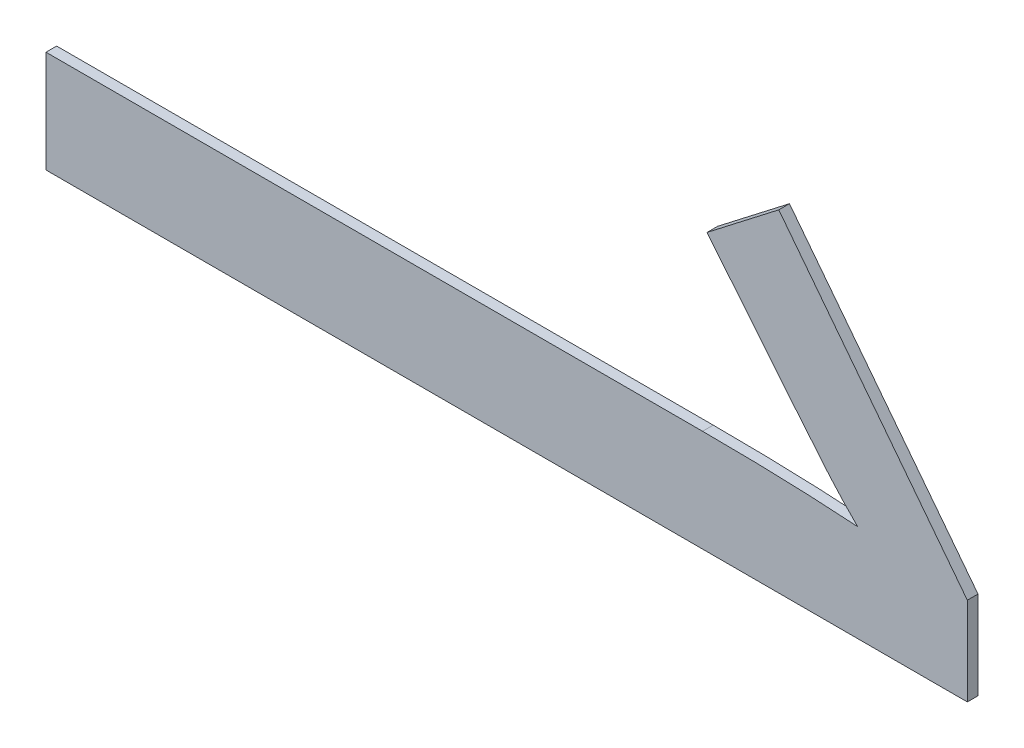
ISO-10303-21;
HEADER;
FILE_DESCRIPTION(('STEP AP214'),'2;1');
FILE_NAME('part.step','',(''),(''),'','','');
FILE_SCHEMA(('AUTOMOTIVE_DESIGN { 1 0 10303 214 1 1 1 1 }'));
ENDSEC;
DATA;
#1=APPLICATION_CONTEXT('core data for automotive mechanical design processes');
#2=APPLICATION_PROTOCOL_DEFINITION('international standard','automotive_design',2000,#1);
#3=PRODUCT_CONTEXT('',#1,'mechanical');
#4=PRODUCT('Part','Part','',(#3));
#5=PRODUCT_RELATED_PRODUCT_CATEGORY('part','',(#4));
#6=PRODUCT_DEFINITION_FORMATION('','',#4);
#7=PRODUCT_DEFINITION_CONTEXT('part definition',#1,'design');
#8=PRODUCT_DEFINITION('design','',#6,#7);
#9=PRODUCT_DEFINITION_SHAPE('','',#8);
#10=(LENGTH_UNIT() NAMED_UNIT(*) SI_UNIT(.MILLI.,.METRE.));
#11=(NAMED_UNIT(*) PLANE_ANGLE_UNIT() SI_UNIT($,.RADIAN.));
#12=(NAMED_UNIT(*) SI_UNIT($,.STERADIAN.) SOLID_ANGLE_UNIT());
#13=UNCERTAINTY_MEASURE_WITH_UNIT(LENGTH_MEASURE(1.E-05),#10,'distance_accuracy_value','');
#14=(GEOMETRIC_REPRESENTATION_CONTEXT(3) GLOBAL_UNCERTAINTY_ASSIGNED_CONTEXT((#13)) GLOBAL_UNIT_ASSIGNED_CONTEXT((#10,
#11,#12)) REPRESENTATION_CONTEXT('',''));
#15=CARTESIAN_POINT('',(0.,0.,0.));
#16=DIRECTION('',(0.,0.,1.));
#17=DIRECTION('',(1.,0.,0.));
#18=AXIS2_PLACEMENT_3D('',#15,#16,#17);
#19=CARTESIAN_POINT('',(32.574920494297,13.734089114766,2.64));
#20=DIRECTION('',(0.,0.,1.));
#21=DIRECTION('',(1.,0.,0.));
#22=AXIS2_PLACEMENT_3D('',#19,#20,#21);
#23=PLANE('',#22);
#24=DIRECTION('',(1.,0.,0.));
#25=VECTOR('',#24,1.);
#26=CARTESIAN_POINT('',(33.916548688995,13.474681045093,2.64));
#27=LINE('',#26,#25);
#28=CARTESIAN_POINT('',(33.608555256577,13.474681045093,2.64));
#29=VERTEX_POINT('',#28);
#30=CARTESIAN_POINT('',(34.224542121413,13.474681045093,2.64));
#31=VERTEX_POINT('',#30);
#32=EDGE_CURVE('E94',#29,#31,#27,.T.);
#33=ORIENTED_EDGE('',*,*,#32,.T.);
#34=CARTESIAN_POINT('',(34.370025505644,13.469951416216,2.64));
#35=CARTESIAN_POINT('',(34.301540479517,13.474681045093,2.64));
#36=CARTESIAN_POINT('',(34.224542121413,13.474681045093,2.64));
#37=B_SPLINE_CURVE_WITH_KNOTS('',2,(#34,#35,#36),.UNSPECIFIED.,.F.,.F.,(3,3),(0.,1.),.UNSPECIFIED.);
#38=CARTESIAN_POINT('',(34.370025505644,13.469951416216,2.64));
#39=VERTEX_POINT('',#38);
#40=EDGE_CURVE('E118',#31,#39,#37,.F.);
#41=ORIENTED_EDGE('',*,*,#40,.T.);
#42=CARTESIAN_POINT('',(34.370025505644,13.469951416216,2.64));
#43=CARTESIAN_POINT('',(34.357539285411,13.482248451294,2.64));
#44=CARTESIAN_POINT('',(34.344012546825,13.497667041431,2.64));
#45=(BOUNDED_CURVE() B_SPLINE_CURVE(2,(#42,#43,#44),.UNSPECIFIED.,.F.,
.F.) B_SPLINE_CURVE_WITH_KNOTS((3,3),(0.,1.),
.UNSPECIFIED.) CURVE() GEOMETRIC_REPRESENTATION_ITEM() RATIONAL_B_SPLINE_CURVE((1.,1.,1.)) REPRESENTATION_ITEM(''));
#46=CARTESIAN_POINT('',(34.344012546825,13.497667041431,2.64));
#47=VERTEX_POINT('',#46);
#48=EDGE_CURVE('E65',#39,#47,#45,.T.);
#49=ORIENTED_EDGE('',*,*,#48,.T.);
#50=CARTESIAN_POINT('',(34.344012546825,13.497667041431,2.64));
#51=CARTESIAN_POINT('',(34.330485808239,13.513085631567,2.64));
#52=CARTESIAN_POINT('',(34.228704194824,13.638326204209,2.64));
#53=(BOUNDED_CURVE() B_SPLINE_CURVE(2,(#50,#51,#52),.UNSPECIFIED.,.F.,
.F.) B_SPLINE_CURVE_WITH_KNOTS((3,3),(0.,1.),
.UNSPECIFIED.) CURVE() GEOMETRIC_REPRESENTATION_ITEM() RATIONAL_B_SPLINE_CURVE((1.,1.,1.)) REPRESENTATION_ITEM(''));
#54=CARTESIAN_POINT('',(34.228704194824,13.638326204209,2.64));
#55=VERTEX_POINT('',#54);
#56=EDGE_CURVE('E21',#47,#55,#53,.T.);
#57=ORIENTED_EDGE('',*,*,#56,.T.);
#58=DIRECTION('',(0.791382768118889,0.611320958518915,0.));
#59=VECTOR('',#58,1.);
#60=CARTESIAN_POINT('',(34.262379152422,13.664339163028,2.64));
#61=LINE('',#60,#59);
#62=CARTESIAN_POINT('',(34.2960541100209,13.6903521218474,2.64));
#63=VERTEX_POINT('',#62);
#64=EDGE_CURVE('E73',#55,#63,#61,.T.);
#65=ORIENTED_EDGE('',*,*,#64,.T.);
#66=DIRECTION('',(0.611764018259349,-0.791040318797452,0.));
#67=VECTOR('',#66,1.);
#68=CARTESIAN_POINT('',(34.384498170006,13.575989695621,2.64));
#69=LINE('',#68,#67);
#70=CARTESIAN_POINT('',(34.4729422299905,13.4616272693946,2.64));
#71=VERTEX_POINT('',#70);
#72=EDGE_CURVE('E134',#63,#71,#69,.T.);
#73=ORIENTED_EDGE('',*,*,#72,.T.);
#74=DIRECTION('',(0.,1.,0.));
#75=VECTOR('',#74,1.);
#76=CARTESIAN_POINT('',(34.47294222999,13.420290313016,2.64));
#77=LINE('',#76,#75);
#78=CARTESIAN_POINT('',(34.47294222999,13.378953356638,2.64));
#79=VERTEX_POINT('',#78);
#80=EDGE_CURVE('E139',#71,#79,#77,.F.);
#81=ORIENTED_EDGE('',*,*,#80,.T.);
#82=DIRECTION('',(-1.,0.,0.));
#83=VECTOR('',#82,1.);
#84=CARTESIAN_POINT('',(34.040748743283,13.378953356638,2.64));
#85=LINE('',#84,#83);
#86=CARTESIAN_POINT('',(33.608555256577,13.378953356638,2.64));
#87=VERTEX_POINT('',#86);
#88=EDGE_CURVE('E96',#79,#87,#85,.T.);
#89=ORIENTED_EDGE('',*,*,#88,.T.);
#90=DIRECTION('',(0.,1.,0.));
#91=VECTOR('',#90,1.);
#92=CARTESIAN_POINT('',(33.608555256577,13.426817200865,2.64));
#93=LINE('',#92,#91);
#94=EDGE_CURVE('E91',#87,#29,#93,.T.);
#95=ORIENTED_EDGE('',*,*,#94,.T.);
#96=EDGE_LOOP('',(#33,#41,#49,#57,#65,#73,#81,#89,#95));
#97=FACE_BOUND('',#96,.T.);
#98=ADVANCED_FACE('F17',(#97),#23,.F.);
#99=CARTESIAN_POINT('',(33.608555256577,13.426817200865,2.64));
#100=DIRECTION('',(1.,0.,0.));
#101=DIRECTION('',(0.,0.,-1.));
#102=AXIS2_PLACEMENT_3D('',#99,#100,#101);
#103=PLANE('',#102);
#104=DIRECTION('',(0.,0.,-1.));
#105=VECTOR('',#104,1.);
#106=CARTESIAN_POINT('',(33.608555256577,13.474681045093,2.64));
#107=LINE('',#106,#105);
#108=CARTESIAN_POINT('',(33.608555256577,13.474681045093,2.65));
#109=VERTEX_POINT('',#108);
#110=EDGE_CURVE('E102',#109,#29,#107,.T.);
#111=ORIENTED_EDGE('',*,*,#110,.T.);
#112=ORIENTED_EDGE('',*,*,#94,.F.);
#113=DIRECTION('',(0.,0.,1.));
#114=VECTOR('',#113,1.);
#115=CARTESIAN_POINT('',(33.608555256577,13.378953356638,2.64));
#116=LINE('',#115,#114);
#117=CARTESIAN_POINT('',(33.608555256577,13.378953356638,2.65));
#118=VERTEX_POINT('',#117);
#119=EDGE_CURVE('E141',#87,#118,#116,.T.);
#120=ORIENTED_EDGE('',*,*,#119,.T.);
#121=DIRECTION('',(0.,1.,0.));
#122=VECTOR('',#121,1.);
#123=CARTESIAN_POINT('',(33.608555256577,13.734089114766,2.65));
#124=LINE('',#123,#122);
#125=EDGE_CURVE('E105',#109,#118,#124,.F.);
#126=ORIENTED_EDGE('',*,*,#125,.F.);
#127=EDGE_LOOP('',(#111,#112,#120,#126));
#128=FACE_BOUND('',#127,.T.);
#129=ADVANCED_FACE('F103',(#128),#103,.F.);
#130=CARTESIAN_POINT('',(34.040748743283,13.378953356638,2.64));
#131=DIRECTION('',(0.,1.,0.));
#132=DIRECTION('',(-1.,0.,0.));
#133=AXIS2_PLACEMENT_3D('',#130,#131,#132);
#134=PLANE('',#133);
#135=ORIENTED_EDGE('',*,*,#119,.F.);
#136=ORIENTED_EDGE('',*,*,#88,.F.);
#137=DIRECTION('',(0.,0.,1.));
#138=VECTOR('',#137,1.);
#139=CARTESIAN_POINT('',(34.47294222999,13.378953356638,2.64));
#140=LINE('',#139,#138);
#141=CARTESIAN_POINT('',(34.47294222999,13.378953356638,2.65));
#142=VERTEX_POINT('',#141);
#143=EDGE_CURVE('E136',#79,#142,#140,.T.);
#144=ORIENTED_EDGE('',*,*,#143,.T.);
#145=DIRECTION('',(1.,0.,0.));
#146=VECTOR('',#145,1.);
#147=CARTESIAN_POINT('',(32.574920494297,13.378953356638,2.65));
#148=LINE('',#147,#146);
#149=EDGE_CURVE('E200',#118,#142,#148,.T.);
#150=ORIENTED_EDGE('',*,*,#149,.F.);
#151=EDGE_LOOP('',(#135,#136,#144,#150));
#152=FACE_BOUND('',#151,.T.);
#153=ADVANCED_FACE('F211',(#152),#134,.F.);
#154=CARTESIAN_POINT('',(34.47294222999,13.420290313016,2.64));
#155=DIRECTION('',(-1.,0.,0.));
#156=DIRECTION('',(0.,0.,1.));
#157=AXIS2_PLACEMENT_3D('',#154,#155,#156);
#158=PLANE('',#157);
#159=ORIENTED_EDGE('',*,*,#143,.F.);
#160=ORIENTED_EDGE('',*,*,#80,.F.);
#161=DIRECTION('',(0.,0.,1.));
#162=VECTOR('',#161,1.);
#163=CARTESIAN_POINT('',(34.4729422299908,13.4616272693946,2.64));
#164=LINE('',#163,#162);
#165=CARTESIAN_POINT('',(34.4729422299903,13.4616272693942,2.65));
#166=VERTEX_POINT('',#165);
#167=EDGE_CURVE('E131',#71,#166,#164,.T.);
#168=ORIENTED_EDGE('',*,*,#167,.T.);
#169=DIRECTION('',(0.,1.,0.));
#170=VECTOR('',#169,1.);
#171=CARTESIAN_POINT('',(34.47294222999,13.734089114766,2.65));
#172=LINE('',#171,#170);
#173=EDGE_CURVE('E191',#142,#166,#172,.T.);
#174=ORIENTED_EDGE('',*,*,#173,.F.);
#175=EDGE_LOOP('',(#159,#160,#168,#174));
#176=FACE_BOUND('',#175,.T.);
#177=ADVANCED_FACE('F257',(#176),#158,.F.);
#178=CARTESIAN_POINT('',(34.384498170006,13.575989695621,2.64));
#179=DIRECTION('',(-0.791040318797452,-0.611764018259349,0.));
#180=DIRECTION('',(0.611764018259349,-0.791040318797452,0.));
#181=AXIS2_PLACEMENT_3D('',#178,#179,#180);
#182=PLANE('',#181);
#183=ORIENTED_EDGE('',*,*,#167,.F.);
#184=ORIENTED_EDGE('',*,*,#72,.F.);
#185=DIRECTION('',(0.,0.,1.));
#186=VECTOR('',#185,1.);
#187=CARTESIAN_POINT('',(34.2960541100208,13.6903521218473,2.64));
#188=LINE('',#187,#186);
#189=CARTESIAN_POINT('',(34.2960541100209,13.6903521218471,2.65));
#190=VERTEX_POINT('',#189);
#191=EDGE_CURVE('E130',#63,#190,#188,.T.);
#192=ORIENTED_EDGE('',*,*,#191,.T.);
#193=DIRECTION('',(-0.611764018257532,0.791040318798858,0.));
#194=VECTOR('',#193,1.);
#195=CARTESIAN_POINT('',(34.47294222999,13.461627269394,2.65));
#196=LINE('',#195,#194);
#197=EDGE_CURVE('E182',#166,#190,#196,.T.);
#198=ORIENTED_EDGE('',*,*,#197,.F.);
#199=EDGE_LOOP('',(#183,#184,#192,#198));
#200=FACE_BOUND('',#199,.T.);
#201=ADVANCED_FACE('F254',(#200),#182,.F.);
#202=CARTESIAN_POINT('',(34.262379152422,13.664339163028,2.64));
#203=DIRECTION('',(0.611320958518915,-0.791382768118889,0.));
#204=DIRECTION('',(0.791382768118889,0.611320958518915,0.));
#205=AXIS2_PLACEMENT_3D('',#202,#203,#204);
#206=PLANE('',#205);
#207=ORIENTED_EDGE('',*,*,#191,.F.);
#208=ORIENTED_EDGE('',*,*,#64,.F.);
#209=DIRECTION('',(0.,0.,1.));
#210=VECTOR('',#209,1.);
#211=CARTESIAN_POINT('',(34.228704194824,13.638326204209,2.64));
#212=LINE('',#211,#210);
#213=CARTESIAN_POINT('',(34.228704194824,13.638326204209,2.65));
#214=VERTEX_POINT('',#213);
#215=EDGE_CURVE('E165',#55,#214,#212,.T.);
#216=ORIENTED_EDGE('',*,*,#215,.T.);
#217=DIRECTION('',(-0.791382768119699,-0.611320958517866,0.));
#218=VECTOR('',#217,1.);
#219=CARTESIAN_POINT('',(34.296054110021,13.690352121847,2.65));
#220=LINE('',#219,#218);
#221=EDGE_CURVE('E159',#190,#214,#220,.T.);
#222=ORIENTED_EDGE('',*,*,#221,.F.);
#223=EDGE_LOOP('',(#207,#208,#216,#222));
#224=FACE_BOUND('',#223,.T.);
#225=ADVANCED_FACE('F250',(#224),#206,.F.);
#226=CARTESIAN_POINT('',(34.344012546825,13.497667041431,2.64));
#227=CARTESIAN_POINT('',(34.330485808239,13.513085631567,2.64));
#228=CARTESIAN_POINT('',(34.228704194824,13.638326204209,2.64));
#229=(BOUNDED_CURVE() B_SPLINE_CURVE(2,(#226,#227,#228),.UNSPECIFIED.,.F.,
.F.) B_SPLINE_CURVE_WITH_KNOTS((3,3),(0.,1.),
.UNSPECIFIED.) CURVE() GEOMETRIC_REPRESENTATION_ITEM() RATIONAL_B_SPLINE_CURVE((1.,1.,1.)) REPRESENTATION_ITEM(''));
#230=DIRECTION('',(0.,0.,1.));
#231=VECTOR('',#230,1.);
#232=SURFACE_OF_LINEAR_EXTRUSION('',#229,#231);
#233=ORIENTED_EDGE('',*,*,#215,.F.);
#234=ORIENTED_EDGE('',*,*,#56,.F.);
#235=DIRECTION('',(0.,0.,1.));
#236=VECTOR('',#235,1.);
#237=CARTESIAN_POINT('',(34.344012546825,13.497667041431,2.64));
#238=LINE('',#237,#236);
#239=CARTESIAN_POINT('',(34.344012546825,13.497667041431,2.65));
#240=VERTEX_POINT('',#239);
#241=EDGE_CURVE('E120',#47,#240,#238,.T.);
#242=ORIENTED_EDGE('',*,*,#241,.T.);
#243=CARTESIAN_POINT('',(34.344012546825,13.497667041431,2.65));
#244=CARTESIAN_POINT('',(34.330485808239,13.513085631567,2.65));
#245=CARTESIAN_POINT('',(34.228704194824,13.638326204209,2.65));
#246=(BOUNDED_CURVE() B_SPLINE_CURVE(2,(#243,#244,#245),.UNSPECIFIED.,.F.,
.F.) B_SPLINE_CURVE_WITH_KNOTS((3,3),(0.,1.),
.UNSPECIFIED.) CURVE() GEOMETRIC_REPRESENTATION_ITEM() RATIONAL_B_SPLINE_CURVE((1.,1.,1.)) REPRESENTATION_ITEM(''));
#247=EDGE_CURVE('E152',#214,#240,#246,.F.);
#248=ORIENTED_EDGE('',*,*,#247,.F.);
#249=EDGE_LOOP('',(#233,#234,#242,#248));
#250=FACE_BOUND('',#249,.T.);
#251=ADVANCED_FACE('F240',(#250),#232,.F.);
#252=CARTESIAN_POINT('',(34.370025505644,13.469951416216,2.64));
#253=CARTESIAN_POINT('',(34.357539285411,13.482248451294,2.64));
#254=CARTESIAN_POINT('',(34.344012546825,13.497667041431,2.64));
#255=(BOUNDED_CURVE() B_SPLINE_CURVE(2,(#252,#253,#254),.UNSPECIFIED.,.F.,
.F.) B_SPLINE_CURVE_WITH_KNOTS((3,3),(0.,1.),
.UNSPECIFIED.) CURVE() GEOMETRIC_REPRESENTATION_ITEM() RATIONAL_B_SPLINE_CURVE((1.,1.,1.)) REPRESENTATION_ITEM(''));
#256=DIRECTION('',(0.,0.,1.));
#257=VECTOR('',#256,1.);
#258=SURFACE_OF_LINEAR_EXTRUSION('',#255,#257);
#259=ORIENTED_EDGE('',*,*,#241,.F.);
#260=ORIENTED_EDGE('',*,*,#48,.F.);
#261=DIRECTION('',(0.,0.,1.));
#262=VECTOR('',#261,1.);
#263=CARTESIAN_POINT('',(34.370025505644,13.469951416216,2.64));
#264=LINE('',#263,#262);
#265=CARTESIAN_POINT('',(34.370025505644,13.469951416216,2.65));
#266=VERTEX_POINT('',#265);
#267=EDGE_CURVE('E107',#39,#266,#264,.T.);
#268=ORIENTED_EDGE('',*,*,#267,.T.);
#269=CARTESIAN_POINT('',(34.370025505644,13.469951416216,2.65));
#270=CARTESIAN_POINT('',(34.357539285411,13.482248451294,2.65));
#271=CARTESIAN_POINT('',(34.344012546825,13.497667041431,2.65));
#272=(BOUNDED_CURVE() B_SPLINE_CURVE(2,(#269,#270,#271),.UNSPECIFIED.,.F.,
.F.) B_SPLINE_CURVE_WITH_KNOTS((3,3),(0.,1.),
.UNSPECIFIED.) CURVE() GEOMETRIC_REPRESENTATION_ITEM() RATIONAL_B_SPLINE_CURVE((1.,1.,1.)) REPRESENTATION_ITEM(''));
#273=EDGE_CURVE('E147',#240,#266,#272,.F.);
#274=ORIENTED_EDGE('',*,*,#273,.F.);
#275=EDGE_LOOP('',(#259,#260,#268,#274));
#276=FACE_BOUND('',#275,.T.);
#277=ADVANCED_FACE('F236',(#276),#258,.F.);
#278=CARTESIAN_POINT('',(34.224542121413,13.474681045093,2.64));
#279=CARTESIAN_POINT('',(34.301540479517,13.474681045093,2.64));
#280=CARTESIAN_POINT('',(34.370025505644,13.469951416216,2.64));
#281=(BOUNDED_CURVE() B_SPLINE_CURVE(2,(#278,#279,#280),.UNSPECIFIED.,.F.,
.F.) B_SPLINE_CURVE_WITH_KNOTS((3,3),(0.,1.),
.UNSPECIFIED.) CURVE() GEOMETRIC_REPRESENTATION_ITEM() RATIONAL_B_SPLINE_CURVE((1.,1.,1.)) REPRESENTATION_ITEM(''));
#282=DIRECTION('',(0.,0.,1.));
#283=VECTOR('',#282,1.);
#284=SURFACE_OF_LINEAR_EXTRUSION('',#281,#283);
#285=ORIENTED_EDGE('',*,*,#267,.F.);
#286=ORIENTED_EDGE('',*,*,#40,.F.);
#287=DIRECTION('',(0.,0.,-1.));
#288=VECTOR('',#287,1.);
#289=CARTESIAN_POINT('',(34.224542121413,13.474681045093,2.64));
#290=LINE('',#289,#288);
#291=CARTESIAN_POINT('',(34.224542121413,13.474681045093,2.65));
#292=VERTEX_POINT('',#291);
#293=EDGE_CURVE('E38',#31,#292,#290,.F.);
#294=ORIENTED_EDGE('',*,*,#293,.T.);
#295=CARTESIAN_POINT('',(34.370025505644,13.469951416216,2.65));
#296=CARTESIAN_POINT('',(34.301540479517,13.474681045093,2.65));
#297=CARTESIAN_POINT('',(34.224542121413,13.474681045093,2.65));
#298=B_SPLINE_CURVE_WITH_KNOTS('',2,(#295,#296,#297),.UNSPECIFIED.,.F.,.F.,(3,3),(0.,1.),.UNSPECIFIED.);
#299=EDGE_CURVE('E29',#266,#292,#298,.T.);
#300=ORIENTED_EDGE('',*,*,#299,.F.);
#301=EDGE_LOOP('',(#285,#286,#294,#300));
#302=FACE_BOUND('',#301,.T.);
#303=ADVANCED_FACE('F232',(#302),#284,.F.);
#304=CARTESIAN_POINT('',(33.916548688995,13.474681045093,2.64));
#305=DIRECTION('',(0.,-1.,0.));
#306=DIRECTION('',(0.,0.,-1.));
#307=AXIS2_PLACEMENT_3D('',#304,#305,#306);
#308=PLANE('',#307);
#309=ORIENTED_EDGE('',*,*,#293,.F.);
#310=ORIENTED_EDGE('',*,*,#32,.F.);
#311=ORIENTED_EDGE('',*,*,#110,.F.);
#312=DIRECTION('',(1.,0.,0.));
#313=VECTOR('',#312,1.);
#314=CARTESIAN_POINT('',(32.574920494297,13.474681045093,2.65));
#315=LINE('',#314,#313);
#316=EDGE_CURVE('E11',#292,#109,#315,.F.);
#317=ORIENTED_EDGE('',*,*,#316,.F.);
#318=EDGE_LOOP('',(#309,#310,#311,#317));
#319=FACE_BOUND('',#318,.T.);
#320=ADVANCED_FACE('F109',(#319),#308,.F.);
#321=CARTESIAN_POINT('',(32.574920494297,13.734089114766,2.65));
#322=DIRECTION('',(0.,0.,1.));
#323=DIRECTION('',(1.,0.,0.));
#324=AXIS2_PLACEMENT_3D('',#321,#322,#323);
#325=PLANE('',#324);
#326=ORIENTED_EDGE('',*,*,#299,.T.);
#327=ORIENTED_EDGE('',*,*,#316,.T.);
#328=ORIENTED_EDGE('',*,*,#125,.T.);
#329=ORIENTED_EDGE('',*,*,#149,.T.);
#330=ORIENTED_EDGE('',*,*,#173,.T.);
#331=ORIENTED_EDGE('',*,*,#197,.T.);
#332=ORIENTED_EDGE('',*,*,#221,.T.);
#333=ORIENTED_EDGE('',*,*,#247,.T.);
#334=ORIENTED_EDGE('',*,*,#273,.T.);
#335=EDGE_LOOP('',(#326,#327,#328,#329,#330,#331,#332,#333,#334));
#336=FACE_BOUND('',#335,.T.);
#337=ADVANCED_FACE('F216',(#336),#325,.T.);
#338=CLOSED_SHELL('',(#98,#129,#153,#177,#201,#225,#251,#277,#303,#320,#337));
#339=MANIFOLD_SOLID_BREP('B1',#338);
#340=ADVANCED_BREP_SHAPE_REPRESENTATION('',(#18,#339),#14);
#341=SHAPE_DEFINITION_REPRESENTATION(#9,#340);
ENDSEC;
END-ISO-10303-21;
